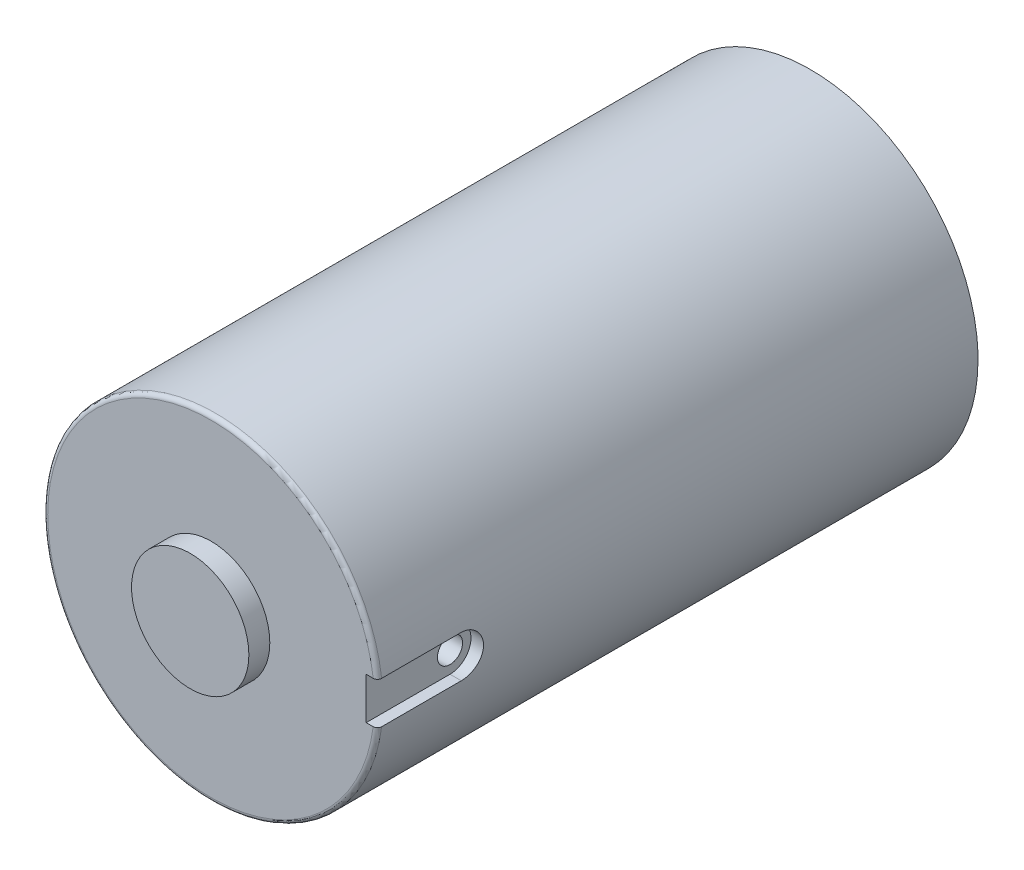
ISO-10303-21;
HEADER;
FILE_DESCRIPTION(('STEP AP214'),'2;1');
FILE_NAME('part.step','',(''),(''),'','','');
FILE_SCHEMA(('AUTOMOTIVE_DESIGN { 1 0 10303 214 1 1 1 1 }'));
ENDSEC;
DATA;
#1=APPLICATION_CONTEXT('core data for automotive mechanical design processes');
#2=APPLICATION_PROTOCOL_DEFINITION('international standard','automotive_design',2000,#1);
#3=PRODUCT_CONTEXT('',#1,'mechanical');
#4=PRODUCT('Part','Part','',(#3));
#5=PRODUCT_RELATED_PRODUCT_CATEGORY('part','',(#4));
#6=PRODUCT_DEFINITION_FORMATION('','',#4);
#7=PRODUCT_DEFINITION_CONTEXT('part definition',#1,'design');
#8=PRODUCT_DEFINITION('design','',#6,#7);
#9=PRODUCT_DEFINITION_SHAPE('','',#8);
#10=(LENGTH_UNIT() NAMED_UNIT(*) SI_UNIT(.MILLI.,.METRE.));
#11=(NAMED_UNIT(*) PLANE_ANGLE_UNIT() SI_UNIT($,.RADIAN.));
#12=(NAMED_UNIT(*) SI_UNIT($,.STERADIAN.) SOLID_ANGLE_UNIT());
#13=UNCERTAINTY_MEASURE_WITH_UNIT(LENGTH_MEASURE(1.E-05),#10,'distance_accuracy_value','');
#14=(GEOMETRIC_REPRESENTATION_CONTEXT(3) GLOBAL_UNCERTAINTY_ASSIGNED_CONTEXT((#13)) GLOBAL_UNIT_ASSIGNED_CONTEXT((#10,
#11,#12)) REPRESENTATION_CONTEXT('',''));
#15=CARTESIAN_POINT('',(0.,0.,0.));
#16=DIRECTION('',(0.,0.,1.));
#17=DIRECTION('',(1.,0.,0.));
#18=AXIS2_PLACEMENT_3D('',#15,#16,#17);
#19=CARTESIAN_POINT('',(0.,0.,113.));
#20=DIRECTION('',(0.,0.,-1.));
#21=DIRECTION('',(-1.,0.,0.));
#22=AXIS2_PLACEMENT_3D('',#19,#20,#21);
#23=CYLINDRICAL_SURFACE('',#22,40.);
#24=CARTESIAN_POINT('',(0.,0.,0.));
#25=DIRECTION('',(0.,0.,1.));
#26=DIRECTION('',(1.,0.,0.));
#27=AXIS2_PLACEMENT_3D('',#24,#25,#26);
#28=CIRCLE('',#27,40.);
#29=CARTESIAN_POINT('',(40.,0.,0.));
#30=VERTEX_POINT('',#29);
#31=EDGE_CURVE('E138',#30,#30,#28,.T.);
#32=ORIENTED_EDGE('',*,*,#31,.T.);
#33=EDGE_LOOP('',(#32));
#34=FACE_BOUND('',#33,.T.);
#35=DIRECTION('',(0.,0.,-1.));
#36=VECTOR('',#35,1.);
#37=CARTESIAN_POINT('',(39.6862696659689,-5.,113.));
#38=LINE('',#37,#36);
#39=CARTESIAN_POINT('',(39.6862696659689,-5.,142.));
#40=VERTEX_POINT('',#39);
#41=CARTESIAN_POINT('',(39.6862696659689,-5.,123.));
#42=VERTEX_POINT('',#41);
#43=EDGE_CURVE('E133',#40,#42,#38,.T.);
#44=ORIENTED_EDGE('',*,*,#43,.F.);
#45=CARTESIAN_POINT('',(0.,0.,142.));
#46=DIRECTION('',(0.,0.,1.));
#47=DIRECTION('',(1.,0.,0.));
#48=AXIS2_PLACEMENT_3D('',#45,#46,#47);
#49=CIRCLE('',#48,40.);
#50=CARTESIAN_POINT('',(39.6862696659689,5.,142.));
#51=VERTEX_POINT('',#50);
#52=EDGE_CURVE('E59',#40,#51,#49,.F.);
#53=ORIENTED_EDGE('',*,*,#52,.T.);
#54=DIRECTION('',(0.,0.,-1.));
#55=VECTOR('',#54,1.);
#56=CARTESIAN_POINT('',(39.6862696659689,5.,113.));
#57=LINE('',#56,#55);
#58=CARTESIAN_POINT('',(39.6862696659689,5.,123.));
#59=VERTEX_POINT('',#58);
#60=EDGE_CURVE('E131',#59,#51,#57,.F.);
#61=ORIENTED_EDGE('',*,*,#60,.F.);
#62=CARTESIAN_POINT('',(39.6862696659689,-5.,123.));
#63=CARTESIAN_POINT('',(39.686262069053,-5.00001572642684,122.859957721732));
#64=CARTESIAN_POINT('',(39.6870106654466,-4.99411711988337,122.719918438942));
#65=CARTESIAN_POINT('',(39.6899652485843,-4.97060539380223,122.440852610243));
#66=CARTESIAN_POINT('',(39.6921711230948,-4.95299317639713,122.301825987177));
#67=CARTESIAN_POINT('',(39.6979823077461,-4.90619230193869,122.025911563076));
#68=CARTESIAN_POINT('',(39.701586183834,-4.87701550702121,121.88902171936));
#69=CARTESIAN_POINT('',(39.7100874415333,-4.80730646333337,121.618207137004));
#70=CARTESIAN_POINT('',(39.7149848154496,-4.76677428211498,121.484282380729));
#71=CARTESIAN_POINT('',(39.7259342654722,-4.67464380932001,121.220323193203));
#72=CARTESIAN_POINT('',(39.7319865022197,-4.6230439781117,121.090289306085));
#73=CARTESIAN_POINT('',(39.7450750479907,-4.50913469652299,120.834994426841));
#74=CARTESIAN_POINT('',(39.7521117201979,-4.44682129167817,120.709735218016));
#75=CARTESIAN_POINT('',(39.7669645515375,-4.31197479530306,120.464967784849));
#76=CARTESIAN_POINT('',(39.7747803547637,-4.23944636379171,120.345456971299));
#77=CARTESIAN_POINT('',(39.7909768128647,-4.08463234453967,120.112908462953));
#78=CARTESIAN_POINT('',(39.7993576763894,-4.00234314399744,119.999873188081));
#79=CARTESIAN_POINT('',(39.8164851557115,-3.82821049322804,119.780606723143));
#80=CARTESIAN_POINT('',(39.8252332573838,-3.73632542050022,119.674408702181));
#81=CARTESIAN_POINT('',(39.8428157321973,-3.54391978100842,119.470080389895));
#82=CARTESIAN_POINT('',(39.8516501360495,-3.44339603297265,119.371953096949));
#83=CARTESIAN_POINT('',(39.8691512047032,-3.23446542045589,119.184515052524));
#84=CARTESIAN_POINT('',(39.8778179051995,-3.12606025738958,119.095202407923));
#85=CARTESIAN_POINT('',(39.8947447961942,-2.90206051551859,118.925965600493));
#86=CARTESIAN_POINT('',(39.9030048355356,-2.78646329901464,118.846044913598));
#87=CARTESIAN_POINT('',(39.9189055895312,-2.54857336406191,118.695977552125));
#88=CARTESIAN_POINT('',(39.9265444217861,-2.4262620484301,118.625860153447));
#89=CARTESIAN_POINT('',(39.940961755137,-2.17606965196634,118.496159055713));
#90=CARTESIAN_POINT('',(39.9477399359838,-2.04818652149164,118.436579274495));
#91=CARTESIAN_POINT('',(39.9602369075118,-1.78785790097395,118.328445728538));
#92=CARTESIAN_POINT('',(39.9659561816116,-1.6554145257158,118.279886930135));
#93=CARTESIAN_POINT('',(39.9761783094363,-1.38681048603176,118.194103045511));
#94=CARTESIAN_POINT('',(39.9806807177414,-1.25064848046968,118.15688210875));
#95=CARTESIAN_POINT('',(39.9883153663586,-0.976382320638343,118.09425464445));
#96=CARTESIAN_POINT('',(39.9914551098788,-0.838293237539909,118.068783369918));
#97=CARTESIAN_POINT('',(39.9963160580955,-0.560443206241299,118.029523017626));
#98=CARTESIAN_POINT('',(39.9980367695577,-0.420681693839792,118.015738001788));
#99=CARTESIAN_POINT('',(40.0009741690871,-0.000386643437801039,117.992160693551));
#100=CARTESIAN_POINT('',(39.9999746912472,0.281458380749849,118.000077590693));
#101=CARTESIAN_POINT('',(39.9941368138514,0.698952272327435,118.047113788276));
#102=CARTESIAN_POINT('',(39.9914787174622,0.836929024171291,118.068563946238));
#103=CARTESIAN_POINT('',(39.9848128090849,1.11058059572486,118.122908829236));
#104=CARTESIAN_POINT('',(39.9808054661516,1.24625619821726,118.155799577174));
#105=CARTESIAN_POINT('',(39.9715484567295,1.5143781890422,118.232806257894));
#106=CARTESIAN_POINT('',(39.9662983425467,1.64682339465209,118.276926236308));
#107=CARTESIAN_POINT('',(39.9547060590202,1.90747758462132,118.376045115256));
#108=CARTESIAN_POINT('',(39.948364282304,2.03568807234821,118.431040105535));
#109=CARTESIAN_POINT('',(39.9347427704754,2.28741356542128,118.551710179469));
#110=CARTESIAN_POINT('',(39.9274602121455,2.41091292618847,118.617417572443));
#111=CARTESIAN_POINT('',(39.9121787272504,2.651897955915,118.758897253875));
#112=CARTESIAN_POINT('',(39.9041800601589,2.76938577902983,118.834665901526));
#113=CARTESIAN_POINT('',(39.8876840861678,2.99762524138419,118.995781852906));
#114=CARTESIAN_POINT('',(39.8791866005155,3.10837443651026,119.081132600523));
#115=CARTESIAN_POINT('',(39.8619356483938,3.32228824200663,119.260762051706));
#116=CARTESIAN_POINT('',(39.8531822755142,3.42545557808075,119.35503751864));
#117=CARTESIAN_POINT('',(39.8355984429311,3.62424144674476,119.552588208022));
#118=CARTESIAN_POINT('',(39.8267678765043,3.71980130932481,119.655922468197));
#119=CARTESIAN_POINT('',(39.8093449011639,3.90184822754469,119.870248808421));
#120=CARTESIAN_POINT('',(39.8007524063702,3.98833858704475,119.981238075292));
#121=CARTESIAN_POINT('',(39.7840405445218,4.15173088261039,120.21021055299));
#122=CARTESIAN_POINT('',(39.7759214992555,4.22862633687338,120.328198413152));
#123=CARTESIAN_POINT('',(39.7603975598606,4.37218470203894,120.570228351483));
#124=CARTESIAN_POINT('',(39.7529923992964,4.43885143603503,120.69426814472));
#125=CARTESIAN_POINT('',(39.7390954475724,4.56159131751889,120.947747197348));
#126=CARTESIAN_POINT('',(39.7326049471734,4.61764953182822,121.077193759513));
#127=CARTESIAN_POINT('',(39.7207395674116,4.7186262485813,121.340355325861));
#128=CARTESIAN_POINT('',(39.7153642626831,4.76354899966787,121.474068680039));
#129=CARTESIAN_POINT('',(39.705887413077,4.84190685906589,121.744705373596));
#130=CARTESIAN_POINT('',(39.7017845061946,4.87535425497621,121.881625110698));
#131=CARTESIAN_POINT('',(39.6949656799998,4.93056537922304,122.157778006497));
#132=CARTESIAN_POINT('',(39.6922490887729,4.95233476787693,122.297010010642));
#133=CARTESIAN_POINT('',(39.6889373057114,4.97879185471256,122.530430029084));
#134=CARTESIAN_POINT('',(39.6879374347028,4.98674957825575,122.624254383909));
#135=CARTESIAN_POINT('',(39.6866035317409,4.99735010865063,122.812049372647));
#136=CARTESIAN_POINT('',(39.6862683839795,5.00000182226638,122.906019495988));
#137=CARTESIAN_POINT('',(39.6862696659689,5.,123.));
#138=B_SPLINE_CURVE_WITH_KNOTS('',3,(#62,#63,#64,#65,#66,#67,#68,#69,#70,#71,#72,#73,#74,#75,
#76,#77,#78,#79,#80,#81,#82,#83,#84,#85,#86,#87,#88,#89,#90,#91,#92,#93,#94,#95,#96,#97,#98,#99,
#100,#101,#102,#103,#104,#105,#106,#107,#108,#109,#110,#111,#112,#113,#114,#115,#116,#117,#118,
#119,#120,#121,#122,#123,#124,#125,#126,#127,#128,#129,#130,#131,#132,#133,#134,#135,#136,#137),
.UNSPECIFIED.,.F.,.F.,(4,2,2,2,2,2,2,2,2,2,2,2,2,2,2,2,2,2,2,2,2,2,2,2,2,2,2,2,2,2,2,2,2,2,2,2,
2,4),(0.,0.419996284773203,0.839960226960756,1.2594945096386,1.67902629660557,2.09861648295014,
2.51836187713978,2.93791640313279,3.35762670835724,3.77923974969132,4.20100872476533,
4.62268691851904,5.04452068574994,5.46758844613905,5.89081317199592,6.31384420573829,
6.73702987603435,7.15785485658493,7.57882604800096,8.41985327338323,8.83846044053581,
9.25692223224352,9.67553499998282,10.0939975227558,10.5137463340195,10.9333436650391,
11.3530922886051,11.7726892653664,12.1952594603157,12.6176751816786,13.0403747369988,
13.462915916947,13.8860475370757,14.3090174655166,14.7315330615827,15.1538436793352,
15.4362010125972,15.7180839767878),.UNSPECIFIED.);
#139=EDGE_CURVE('E105',#42,#59,#138,.T.);
#140=ORIENTED_EDGE('',*,*,#139,.F.);
#141=EDGE_LOOP('',(#44,#53,#61,#140));
#142=FACE_BOUND('',#141,.T.);
#143=ADVANCED_FACE('F45',(#34,#142),#23,.T.);
#144=CARTESIAN_POINT('',(0.,0.,143.));
#145=DIRECTION('',(0.,0.,1.));
#146=DIRECTION('',(1.,0.,0.));
#147=AXIS2_PLACEMENT_3D('',#144,#145,#146);
#148=PLANE('',#147);
#149=CARTESIAN_POINT('',(0.,0.,143.));
#150=DIRECTION('',(0.,0.,1.));
#151=DIRECTION('',(1.,0.,0.));
#152=AXIS2_PLACEMENT_3D('',#149,#150,#151);
#153=CIRCLE('',#152,14.);
#154=CARTESIAN_POINT('',(14.,0.,143.));
#155=VERTEX_POINT('',#154);
#156=EDGE_CURVE('E139',#155,#155,#153,.T.);
#157=ORIENTED_EDGE('',*,*,#156,.F.);
#158=EDGE_LOOP('',(#157));
#159=FACE_BOUND('',#158,.T.);
#160=DIRECTION('',(1.,0.,0.));
#161=VECTOR('',#160,1.);
#162=CARTESIAN_POINT('',(0.,5.,143.));
#163=LINE('',#162,#161);
#164=CARTESIAN_POINT('',(37.,5.,143.));
#165=VERTEX_POINT('',#164);
#166=CARTESIAN_POINT('',(38.6781592116274,5.,143.));
#167=VERTEX_POINT('',#166);
#168=EDGE_CURVE('E106',#165,#167,#163,.T.);
#169=ORIENTED_EDGE('',*,*,#168,.T.);
#170=CARTESIAN_POINT('',(0.,0.,143.));
#171=DIRECTION('',(0.,0.,1.));
#172=DIRECTION('',(1.,0.,0.));
#173=AXIS2_PLACEMENT_3D('',#170,#171,#172);
#174=CIRCLE('',#173,39.);
#175=CARTESIAN_POINT('',(38.6781592116274,-5.,143.));
#176=VERTEX_POINT('',#175);
#177=EDGE_CURVE('E103',#167,#176,#174,.T.);
#178=ORIENTED_EDGE('',*,*,#177,.T.);
#179=DIRECTION('',(-1.,0.,0.));
#180=VECTOR('',#179,1.);
#181=CARTESIAN_POINT('',(0.,-5.,143.));
#182=LINE('',#181,#180);
#183=CARTESIAN_POINT('',(37.,-5.,143.));
#184=VERTEX_POINT('',#183);
#185=EDGE_CURVE('E97',#176,#184,#182,.T.);
#186=ORIENTED_EDGE('',*,*,#185,.T.);
#187=DIRECTION('',(0.,-1.,0.));
#188=VECTOR('',#187,1.);
#189=CARTESIAN_POINT('',(37.,0.,143.));
#190=LINE('',#189,#188);
#191=EDGE_CURVE('E101',#165,#184,#190,.T.);
#192=ORIENTED_EDGE('',*,*,#191,.F.);
#193=EDGE_LOOP('',(#169,#178,#186,#192));
#194=FACE_BOUND('',#193,.T.);
#195=ADVANCED_FACE('F100',(#159,#194),#148,.T.);
#196=CARTESIAN_POINT('',(0.,0.,0.));
#197=DIRECTION('',(0.,0.,1.));
#198=DIRECTION('',(1.,0.,0.));
#199=AXIS2_PLACEMENT_3D('',#196,#197,#198);
#200=PLANE('',#199);
#201=ORIENTED_EDGE('',*,*,#31,.F.);
#202=EDGE_LOOP('',(#201));
#203=FACE_BOUND('',#202,.T.);
#204=ADVANCED_FACE('F176',(#203),#200,.F.);
#205=CARTESIAN_POINT('',(0.,0.,148.));
#206=DIRECTION('',(0.,0.,-1.));
#207=DIRECTION('',(-1.,0.,0.));
#208=AXIS2_PLACEMENT_3D('',#205,#206,#207);
#209=CYLINDRICAL_SURFACE('',#208,14.);
#210=CARTESIAN_POINT('',(0.,0.,148.));
#211=DIRECTION('',(0.,0.,1.));
#212=DIRECTION('',(1.,0.,0.));
#213=AXIS2_PLACEMENT_3D('',#210,#211,#212);
#214=CIRCLE('',#213,14.);
#215=CARTESIAN_POINT('',(14.,0.,148.));
#216=VERTEX_POINT('',#215);
#217=EDGE_CURVE('E135',#216,#216,#214,.T.);
#218=ORIENTED_EDGE('',*,*,#217,.F.);
#219=EDGE_LOOP('',(#218));
#220=FACE_BOUND('',#219,.T.);
#221=ORIENTED_EDGE('',*,*,#156,.T.);
#222=EDGE_LOOP('',(#221));
#223=FACE_BOUND('',#222,.T.);
#224=ADVANCED_FACE('F172',(#220,#223),#209,.T.);
#225=CARTESIAN_POINT('',(0.,0.,148.));
#226=DIRECTION('',(0.,0.,1.));
#227=DIRECTION('',(1.,0.,0.));
#228=AXIS2_PLACEMENT_3D('',#225,#226,#227);
#229=PLANE('',#228);
#230=ORIENTED_EDGE('',*,*,#217,.T.);
#231=EDGE_LOOP('',(#230));
#232=FACE_BOUND('',#231,.T.);
#233=ADVANCED_FACE('F158',(#232),#229,.T.);
#234=CARTESIAN_POINT('',(71.,0.,123.));
#235=DIRECTION('',(-1.,0.,0.));
#236=DIRECTION('',(0.,0.,1.));
#237=AXIS2_PLACEMENT_3D('',#234,#235,#236);
#238=CYLINDRICAL_SURFACE('',#237,5.);
#239=ORIENTED_EDGE('',*,*,#139,.T.);
#240=DIRECTION('',(-1.,0.,0.));
#241=VECTOR('',#240,1.);
#242=CARTESIAN_POINT('',(71.,5.,123.));
#243=LINE('',#242,#241);
#244=CARTESIAN_POINT('',(37.,5.,123.));
#245=VERTEX_POINT('',#244);
#246=EDGE_CURVE('E128',#59,#245,#243,.T.);
#247=ORIENTED_EDGE('',*,*,#246,.T.);
#248=CARTESIAN_POINT('',(37.,0.,123.));
#249=DIRECTION('',(1.,0.,0.));
#250=DIRECTION('',(0.,0.,-1.));
#251=AXIS2_PLACEMENT_3D('',#248,#249,#250);
#252=CIRCLE('',#251,5.);
#253=CARTESIAN_POINT('',(37.,-5.,123.));
#254=VERTEX_POINT('',#253);
#255=EDGE_CURVE('E122',#254,#245,#252,.T.);
#256=ORIENTED_EDGE('',*,*,#255,.F.);
#257=DIRECTION('',(-1.,0.,0.));
#258=VECTOR('',#257,1.);
#259=CARTESIAN_POINT('',(71.,-5.,123.));
#260=LINE('',#259,#258);
#261=EDGE_CURVE('E121',#42,#254,#260,.T.);
#262=ORIENTED_EDGE('',*,*,#261,.F.);
#263=EDGE_LOOP('',(#239,#247,#256,#262));
#264=FACE_BOUND('',#263,.T.);
#265=ADVANCED_FACE('F154',(#264),#238,.F.);
#266=CARTESIAN_POINT('',(71.,-5.,143.));
#267=DIRECTION('',(0.,1.,0.));
#268=DIRECTION('',(0.,0.,1.));
#269=AXIS2_PLACEMENT_3D('',#266,#267,#268);
#270=PLANE('',#269);
#271=ORIENTED_EDGE('',*,*,#185,.F.);
#272=CARTESIAN_POINT('',(38.6781592116274,-5.,143.));
#273=CARTESIAN_POINT('',(38.7066930806395,-5.,142.999999685316));
#274=CARTESIAN_POINT('',(38.7352133575475,-5.,142.99879805664));
#275=CARTESIAN_POINT('',(38.7920512469439,-5.,142.99400315777));
#276=CARTESIAN_POINT('',(38.8203688654217,-5.,142.990409958556));
#277=CARTESIAN_POINT('',(38.9046778701903,-5.,142.976072845567));
#278=CARTESIAN_POINT('',(38.9601067294533,-5.,142.961771344458));
#279=CARTESIAN_POINT('',(39.0677783237829,-5.,142.924056966605));
#280=CARTESIAN_POINT('',(39.1200192237975,-5.,142.900638898359));
#281=CARTESIAN_POINT('',(39.2198025309353,-5.,142.84533463001));
#282=CARTESIAN_POINT('',(39.2673460963006,-5.,142.8134505246));
#283=CARTESIAN_POINT('',(39.3561781123011,-5.,142.742237421034));
#284=CARTESIAN_POINT('',(39.3974902782262,-5.,142.702937999772));
#285=CARTESIAN_POINT('',(39.4728774848319,-5.,142.617903084064));
#286=CARTESIAN_POINT('',(39.5069512200852,-5.,142.572166431154));
#287=CARTESIAN_POINT('',(39.5666077777966,-5.,142.475936230437));
#288=CARTESIAN_POINT('',(39.5922522538832,-5.,142.425480855942));
#289=CARTESIAN_POINT('',(39.6346231518364,-5.,142.320971848814));
#290=CARTESIAN_POINT('',(39.6513558090662,-5.,142.266920761871));
#291=CARTESIAN_POINT('',(39.6709916218137,-5.,142.177080890271));
#292=CARTESIAN_POINT('',(39.6767175093353,-5.,142.141884019537));
#293=CARTESIAN_POINT('',(39.6843557839676,-5.,142.071129975925));
#294=CARTESIAN_POINT('',(39.6862736159962,-5.,142.035573390657));
#295=CARTESIAN_POINT('',(39.6862696659689,-5.,142.));
#296=B_SPLINE_CURVE_WITH_KNOTS('',3,(#272,#273,#274,#275,#276,#277,#278,#279,#280,#281,#282,
#283,#284,#285,#286,#287,#288,#289,#290,#291,#292,#293,#294,#295),.UNSPECIFIED.,.F.,.F.,(4,2,2,
2,2,2,2,2,2,2,2,4),(0.,0.0855492676429305,0.17109599638766,0.341948575987127,0.512898591632863,
0.683806349640355,0.854046304442588,1.02431693544957,1.19331291722827,1.36219050115014,
1.46897904721158,1.57561479225267),.UNSPECIFIED.);
#297=EDGE_CURVE('E73',#176,#40,#296,.T.);
#298=ORIENTED_EDGE('',*,*,#297,.T.);
#299=ORIENTED_EDGE('',*,*,#43,.T.);
#300=ORIENTED_EDGE('',*,*,#261,.T.);
#301=DIRECTION('',(0.,0.,-1.));
#302=VECTOR('',#301,1.);
#303=CARTESIAN_POINT('',(37.,-5.,143.));
#304=LINE('',#303,#302);
#305=EDGE_CURVE('E112',#184,#254,#304,.T.);
#306=ORIENTED_EDGE('',*,*,#305,.F.);
#307=EDGE_LOOP('',(#271,#298,#299,#300,#306));
#308=FACE_BOUND('',#307,.T.);
#309=ADVANCED_FACE('F119',(#308),#270,.T.);
#310=CARTESIAN_POINT('',(71.,5.,143.));
#311=DIRECTION('',(0.,-1.,0.));
#312=DIRECTION('',(0.,0.,-1.));
#313=AXIS2_PLACEMENT_3D('',#310,#311,#312);
#314=PLANE('',#313);
#315=ORIENTED_EDGE('',*,*,#60,.T.);
#316=CARTESIAN_POINT('',(39.6862696659689,5.,142.));
#317=CARTESIAN_POINT('',(39.6862695932998,5.,142.027973270347));
#318=CARTESIAN_POINT('',(39.6850858793615,5.,142.055933084624));
#319=CARTESIAN_POINT('',(39.6803643361238,5.,142.111651427591));
#320=CARTESIAN_POINT('',(39.6768266558197,5.,142.139409968907));
#321=CARTESIAN_POINT('',(39.6627197534806,5.,142.222024609885));
#322=CARTESIAN_POINT('',(39.6486565557779,5.,142.276325371551));
#323=CARTESIAN_POINT('',(39.611620510026,5.,142.381790505895));
#324=CARTESIAN_POINT('',(39.5886440531076,5.,142.43295359844));
#325=CARTESIAN_POINT('',(39.534457558978,5.,142.530714859825));
#326=CARTESIAN_POINT('',(39.5032484659289,5.,142.577313551294));
#327=CARTESIAN_POINT('',(39.4333828821922,5.,142.66480196509));
#328=CARTESIAN_POINT('',(39.3947015049733,5.,142.705671799734));
#329=CARTESIAN_POINT('',(39.3110632664385,5.,142.780403799096));
#330=CARTESIAN_POINT('',(39.2661051014864,5.,142.81426450444));
#331=CARTESIAN_POINT('',(39.1708357268978,5.,142.87428189959));
#332=CARTESIAN_POINT('',(39.1204863178709,5.,142.900377884076));
#333=CARTESIAN_POINT('',(39.0161511333748,5.,142.943805424173));
#334=CARTESIAN_POINT('',(38.9621670744027,5.,142.961141084481));
#335=CARTESIAN_POINT('',(38.8696099637505,5.,142.982553071256));
#336=CARTESIAN_POINT('',(38.8315876184606,5.,142.989091904354));
#337=CARTESIAN_POINT('',(38.7551014980221,5.,142.997815011338));
#338=CARTESIAN_POINT('',(38.7166384270162,5.,143.000005460596));
#339=CARTESIAN_POINT('',(38.6781592116274,5.,143.));
#340=B_SPLINE_CURVE_WITH_KNOTS('',3,(#316,#317,#318,#319,#320,#321,#322,#323,#324,#325,#326,
#327,#328,#329,#330,#331,#332,#333,#334,#335,#336,#337,#338,#339),.UNSPECIFIED.,.F.,.F.,(4,2,2,
2,2,2,2,2,2,2,2,4),(0.,0.0838680770813549,0.167730846203209,0.335143497982055,0.502624003954837,
0.670085310726946,0.838114276877122,1.00617819329081,1.17552346457575,1.34478931447706,
1.46029737733697,1.57564128336874),.UNSPECIFIED.);
#341=EDGE_CURVE('E11',#51,#167,#340,.T.);
#342=ORIENTED_EDGE('',*,*,#341,.T.);
#343=ORIENTED_EDGE('',*,*,#168,.F.);
#344=DIRECTION('',(0.,0.,1.));
#345=VECTOR('',#344,1.);
#346=CARTESIAN_POINT('',(37.,5.,143.));
#347=LINE('',#346,#345);
#348=EDGE_CURVE('E115',#245,#165,#347,.T.);
#349=ORIENTED_EDGE('',*,*,#348,.F.);
#350=ORIENTED_EDGE('',*,*,#246,.F.);
#351=EDGE_LOOP('',(#315,#342,#343,#349,#350));
#352=FACE_BOUND('',#351,.T.);
#353=ADVANCED_FACE('F160',(#352),#314,.T.);
#354=CARTESIAN_POINT('',(37.,0.,123.));
#355=DIRECTION('',(1.,0.,0.));
#356=DIRECTION('',(0.,0.,-1.));
#357=AXIS2_PLACEMENT_3D('',#354,#355,#356);
#358=PLANE('',#357);
#359=CARTESIAN_POINT('',(37.,0.,123.));
#360=DIRECTION('',(1.,0.,0.));
#361=DIRECTION('',(0.,0.,-1.));
#362=AXIS2_PLACEMENT_3D('',#359,#360,#361);
#363=CIRCLE('',#362,3.00000000000001);
#364=CARTESIAN_POINT('',(37.,0.,120.));
#365=VERTEX_POINT('',#364);
#366=EDGE_CURVE('E216',#365,#365,#363,.T.);
#367=ORIENTED_EDGE('',*,*,#366,.F.);
#368=EDGE_LOOP('',(#367));
#369=FACE_BOUND('',#368,.T.);
#370=ORIENTED_EDGE('',*,*,#191,.T.);
#371=ORIENTED_EDGE('',*,*,#305,.T.);
#372=ORIENTED_EDGE('',*,*,#255,.T.);
#373=ORIENTED_EDGE('',*,*,#348,.T.);
#374=EDGE_LOOP('',(#370,#371,#372,#373));
#375=FACE_BOUND('',#374,.T.);
#376=ADVANCED_FACE('F110',(#369,#375),#358,.T.);
#377=CARTESIAN_POINT('',(27.,0.,123.));
#378=DIRECTION('',(1.,0.,0.));
#379=DIRECTION('',(0.,0.,-1.));
#380=AXIS2_PLACEMENT_3D('',#377,#378,#379);
#381=CYLINDRICAL_SURFACE('',#380,3.00000000000001);
#382=CARTESIAN_POINT('',(27.,0.,123.));
#383=DIRECTION('',(1.,0.,0.));
#384=DIRECTION('',(0.,0.,-1.));
#385=AXIS2_PLACEMENT_3D('',#382,#383,#384);
#386=CIRCLE('',#385,3.00000000000001);
#387=CARTESIAN_POINT('',(27.,0.,120.));
#388=VERTEX_POINT('',#387);
#389=EDGE_CURVE('E117',#388,#388,#386,.T.);
#390=ORIENTED_EDGE('',*,*,#389,.F.);
#391=EDGE_LOOP('',(#390));
#392=FACE_BOUND('',#391,.T.);
#393=ORIENTED_EDGE('',*,*,#366,.T.);
#394=EDGE_LOOP('',(#393));
#395=FACE_BOUND('',#394,.T.);
#396=ADVANCED_FACE('F199',(#392,#395),#381,.F.);
#397=CARTESIAN_POINT('',(27.,0.,123.));
#398=DIRECTION('',(1.,0.,0.));
#399=DIRECTION('',(0.,0.,-1.));
#400=AXIS2_PLACEMENT_3D('',#397,#398,#399);
#401=PLANE('',#400);
#402=ORIENTED_EDGE('',*,*,#389,.T.);
#403=EDGE_LOOP('',(#402));
#404=FACE_BOUND('',#403,.T.);
#405=ADVANCED_FACE('F204',(#404),#401,.T.);
#406=CARTESIAN_POINT('',(0.,0.,142.));
#407=DIRECTION('',(0.,0.,1.));
#408=DIRECTION('',(1.,0.,0.));
#409=AXIS2_PLACEMENT_3D('',#406,#407,#408);
#410=TOROIDAL_SURFACE('',#409,39.,1.);
#411=ORIENTED_EDGE('',*,*,#341,.F.);
#412=ORIENTED_EDGE('',*,*,#52,.F.);
#413=ORIENTED_EDGE('',*,*,#297,.F.);
#414=ORIENTED_EDGE('',*,*,#177,.F.);
#415=EDGE_LOOP('',(#411,#412,#413,#414));
#416=FACE_BOUND('',#415,.T.);
#417=ADVANCED_FACE('F47',(#416),#410,.T.);
#418=CLOSED_SHELL('',(#143,#195,#204,#224,#233,#265,#309,#353,#376,#396,#405,#417));
#419=MANIFOLD_SOLID_BREP('B2',#418);
#420=ADVANCED_BREP_SHAPE_REPRESENTATION('',(#18,#419),#14);
#421=SHAPE_DEFINITION_REPRESENTATION(#9,#420);
ENDSEC;
END-ISO-10303-21;
